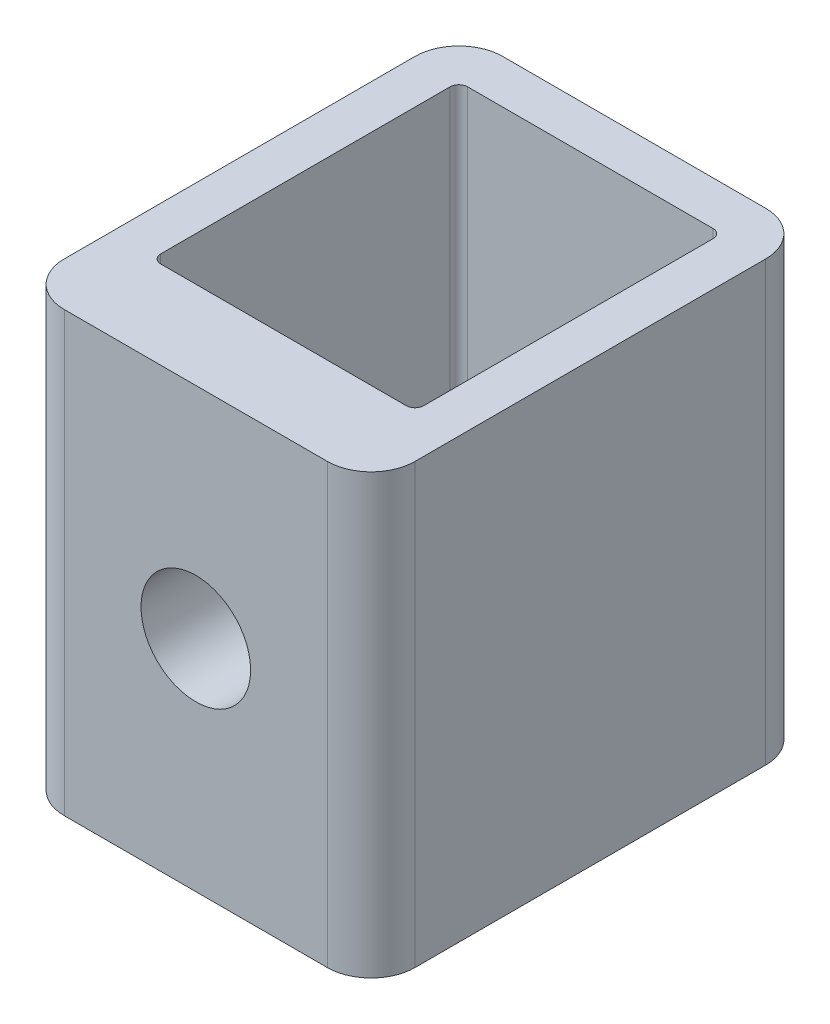
ISO-10303-21;
HEADER;
FILE_DESCRIPTION(('STEP AP214'),'2;1');
FILE_NAME('part.step','',(''),(''),'','','');
FILE_SCHEMA(('AUTOMOTIVE_DESIGN { 1 0 10303 214 1 1 1 1 }'));
ENDSEC;
DATA;
#1=APPLICATION_CONTEXT('core data for automotive mechanical design processes');
#2=APPLICATION_PROTOCOL_DEFINITION('international standard','automotive_design',2000,#1);
#3=PRODUCT_CONTEXT('',#1,'mechanical');
#4=PRODUCT('Part','Part','',(#3));
#5=PRODUCT_RELATED_PRODUCT_CATEGORY('part','',(#4));
#6=PRODUCT_DEFINITION_FORMATION('','',#4);
#7=PRODUCT_DEFINITION_CONTEXT('part definition',#1,'design');
#8=PRODUCT_DEFINITION('design','',#6,#7);
#9=PRODUCT_DEFINITION_SHAPE('','',#8);
#10=(LENGTH_UNIT() NAMED_UNIT(*) SI_UNIT(.MILLI.,.METRE.));
#11=(NAMED_UNIT(*) PLANE_ANGLE_UNIT() SI_UNIT($,.RADIAN.));
#12=(NAMED_UNIT(*) SI_UNIT($,.STERADIAN.) SOLID_ANGLE_UNIT());
#13=UNCERTAINTY_MEASURE_WITH_UNIT(LENGTH_MEASURE(1.E-05),#10,'distance_accuracy_value','');
#14=(GEOMETRIC_REPRESENTATION_CONTEXT(3) GLOBAL_UNCERTAINTY_ASSIGNED_CONTEXT((#13)) GLOBAL_UNIT_ASSIGNED_CONTEXT((#10,
#11,#12)) REPRESENTATION_CONTEXT('',''));
#15=CARTESIAN_POINT('',(0.,0.,0.));
#16=DIRECTION('',(0.,0.,1.));
#17=DIRECTION('',(1.,0.,0.));
#18=AXIS2_PLACEMENT_3D('',#15,#16,#17);
#19=CARTESIAN_POINT('',(3.4,5.,3.9));
#20=DIRECTION('',(0.,1.,0.));
#21=DIRECTION('',(0.,0.,1.));
#22=AXIS2_PLACEMENT_3D('',#19,#20,#21);
#23=CYLINDRICAL_SURFACE('',#22,0.0999999999999998);
#24=DIRECTION('',(0.,1.,0.));
#25=VECTOR('',#24,1.);
#26=CARTESIAN_POINT('',(3.5,5.,3.9));
#27=LINE('',#26,#25);
#28=CARTESIAN_POINT('',(3.5,5.,3.9));
#29=VERTEX_POINT('',#28);
#30=CARTESIAN_POINT('',(3.5,0.,3.9));
#31=VERTEX_POINT('',#30);
#32=EDGE_CURVE('E138',#29,#31,#27,.F.);
#33=ORIENTED_EDGE('',*,*,#32,.T.);
#34=CARTESIAN_POINT('',(3.4,0.,3.9));
#35=DIRECTION('',(0.,1.,0.));
#36=DIRECTION('',(0.,0.,1.));
#37=AXIS2_PLACEMENT_3D('',#34,#35,#36);
#38=CIRCLE('',#37,0.0999999999999998);
#39=CARTESIAN_POINT('',(3.4,0.,4.));
#40=VERTEX_POINT('',#39);
#41=EDGE_CURVE('E19',#40,#31,#38,.T.);
#42=ORIENTED_EDGE('',*,*,#41,.F.);
#43=DIRECTION('',(0.,1.,0.));
#44=VECTOR('',#43,1.);
#45=CARTESIAN_POINT('',(3.4,5.,4.));
#46=LINE('',#45,#44);
#47=CARTESIAN_POINT('',(3.4,5.,4.));
#48=VERTEX_POINT('',#47);
#49=EDGE_CURVE('E213',#40,#48,#46,.T.);
#50=ORIENTED_EDGE('',*,*,#49,.T.);
#51=CARTESIAN_POINT('',(3.4,5.,3.9));
#52=DIRECTION('',(0.,1.,0.));
#53=DIRECTION('',(0.,0.,1.));
#54=AXIS2_PLACEMENT_3D('',#51,#52,#53);
#55=CIRCLE('',#54,0.0999999999999998);
#56=EDGE_CURVE('E136',#29,#48,#55,.F.);
#57=ORIENTED_EDGE('',*,*,#56,.F.);
#58=EDGE_LOOP('',(#33,#42,#50,#57));
#59=FACE_BOUND('',#58,.T.);
#60=ADVANCED_FACE('F16',(#59),#23,.F.);
#61=CARTESIAN_POINT('',(0.6,5.,3.9));
#62=DIRECTION('',(0.,1.,0.));
#63=DIRECTION('',(0.,0.,1.));
#64=AXIS2_PLACEMENT_3D('',#61,#62,#63);
#65=CYLINDRICAL_SURFACE('',#64,0.0999999999999998);
#66=DIRECTION('',(0.,1.,0.));
#67=VECTOR('',#66,1.);
#68=CARTESIAN_POINT('',(0.6,5.,4.));
#69=LINE('',#68,#67);
#70=CARTESIAN_POINT('',(0.6,5.,4.));
#71=VERTEX_POINT('',#70);
#72=CARTESIAN_POINT('',(0.6,0.,4.));
#73=VERTEX_POINT('',#72);
#74=EDGE_CURVE('E215',#71,#73,#69,.F.);
#75=ORIENTED_EDGE('',*,*,#74,.T.);
#76=CARTESIAN_POINT('',(0.6,0.,3.9));
#77=DIRECTION('',(0.,1.,0.));
#78=DIRECTION('',(0.,0.,1.));
#79=AXIS2_PLACEMENT_3D('',#76,#77,#78);
#80=CIRCLE('',#79,0.0999999999999998);
#81=CARTESIAN_POINT('',(0.5,0.,3.9));
#82=VERTEX_POINT('',#81);
#83=EDGE_CURVE('E250',#82,#73,#80,.T.);
#84=ORIENTED_EDGE('',*,*,#83,.F.);
#85=DIRECTION('',(0.,1.,0.));
#86=VECTOR('',#85,1.);
#87=CARTESIAN_POINT('',(0.5,5.,3.9));
#88=LINE('',#87,#86);
#89=CARTESIAN_POINT('',(0.5,5.,3.9));
#90=VERTEX_POINT('',#89);
#91=EDGE_CURVE('E207',#82,#90,#88,.T.);
#92=ORIENTED_EDGE('',*,*,#91,.T.);
#93=CARTESIAN_POINT('',(0.6,5.,3.9));
#94=DIRECTION('',(0.,1.,0.));
#95=DIRECTION('',(0.,0.,1.));
#96=AXIS2_PLACEMENT_3D('',#93,#94,#95);
#97=CIRCLE('',#96,0.0999999999999998);
#98=EDGE_CURVE('E248',#71,#90,#97,.F.);
#99=ORIENTED_EDGE('',*,*,#98,.F.);
#100=EDGE_LOOP('',(#75,#84,#92,#99));
#101=FACE_BOUND('',#100,.T.);
#102=ADVANCED_FACE('F259',(#101),#65,.F.);
#103=CARTESIAN_POINT('',(3.4,5.,0.6));
#104=DIRECTION('',(0.,1.,0.));
#105=DIRECTION('',(0.,0.,1.));
#106=AXIS2_PLACEMENT_3D('',#103,#104,#105);
#107=CYLINDRICAL_SURFACE('',#106,0.1);
#108=DIRECTION('',(0.,1.,0.));
#109=VECTOR('',#108,1.);
#110=CARTESIAN_POINT('',(3.4,5.,0.5));
#111=LINE('',#110,#109);
#112=CARTESIAN_POINT('',(3.4,5.,0.5));
#113=VERTEX_POINT('',#112);
#114=CARTESIAN_POINT('',(3.4,0.,0.5));
#115=VERTEX_POINT('',#114);
#116=EDGE_CURVE('E204',#113,#115,#111,.F.);
#117=ORIENTED_EDGE('',*,*,#116,.T.);
#118=CARTESIAN_POINT('',(3.4,0.,0.6));
#119=DIRECTION('',(0.,1.,0.));
#120=DIRECTION('',(0.,0.,1.));
#121=AXIS2_PLACEMENT_3D('',#118,#119,#120);
#122=CIRCLE('',#121,0.1);
#123=CARTESIAN_POINT('',(3.5,0.,0.6));
#124=VERTEX_POINT('',#123);
#125=EDGE_CURVE('E246',#124,#115,#122,.T.);
#126=ORIENTED_EDGE('',*,*,#125,.F.);
#127=DIRECTION('',(0.,1.,0.));
#128=VECTOR('',#127,1.);
#129=CARTESIAN_POINT('',(3.5,5.,0.6));
#130=LINE('',#129,#128);
#131=CARTESIAN_POINT('',(3.5,5.,0.6));
#132=VERTEX_POINT('',#131);
#133=EDGE_CURVE('E143',#124,#132,#130,.T.);
#134=ORIENTED_EDGE('',*,*,#133,.T.);
#135=CARTESIAN_POINT('',(3.4,5.,0.6));
#136=DIRECTION('',(0.,1.,0.));
#137=DIRECTION('',(0.,0.,1.));
#138=AXIS2_PLACEMENT_3D('',#135,#136,#137);
#139=CIRCLE('',#138,0.1);
#140=EDGE_CURVE('E244',#113,#132,#139,.F.);
#141=ORIENTED_EDGE('',*,*,#140,.F.);
#142=EDGE_LOOP('',(#117,#126,#134,#141));
#143=FACE_BOUND('',#142,.T.);
#144=ADVANCED_FACE('F277',(#143),#107,.F.);
#145=CARTESIAN_POINT('',(0.6,5.,0.6));
#146=DIRECTION('',(0.,1.,0.));
#147=DIRECTION('',(0.,0.,1.));
#148=AXIS2_PLACEMENT_3D('',#145,#146,#147);
#149=CYLINDRICAL_SURFACE('',#148,0.1);
#150=DIRECTION('',(0.,1.,0.));
#151=VECTOR('',#150,1.);
#152=CARTESIAN_POINT('',(0.5,5.,0.6));
#153=LINE('',#152,#151);
#154=CARTESIAN_POINT('',(0.5,5.,0.6));
#155=VERTEX_POINT('',#154);
#156=CARTESIAN_POINT('',(0.5,0.,0.6));
#157=VERTEX_POINT('',#156);
#158=EDGE_CURVE('E210',#155,#157,#153,.F.);
#159=ORIENTED_EDGE('',*,*,#158,.T.);
#160=CARTESIAN_POINT('',(0.6,0.,0.6));
#161=DIRECTION('',(0.,1.,0.));
#162=DIRECTION('',(0.,0.,1.));
#163=AXIS2_PLACEMENT_3D('',#160,#161,#162);
#164=CIRCLE('',#163,0.1);
#165=CARTESIAN_POINT('',(0.6,0.,0.5));
#166=VERTEX_POINT('',#165);
#167=EDGE_CURVE('E242',#166,#157,#164,.T.);
#168=ORIENTED_EDGE('',*,*,#167,.F.);
#169=DIRECTION('',(0.,1.,0.));
#170=VECTOR('',#169,1.);
#171=CARTESIAN_POINT('',(0.6,5.,0.5));
#172=LINE('',#171,#170);
#173=CARTESIAN_POINT('',(0.6,5.,0.5));
#174=VERTEX_POINT('',#173);
#175=EDGE_CURVE('E201',#166,#174,#172,.T.);
#176=ORIENTED_EDGE('',*,*,#175,.T.);
#177=CARTESIAN_POINT('',(0.6,5.,0.6));
#178=DIRECTION('',(0.,1.,0.));
#179=DIRECTION('',(0.,0.,1.));
#180=AXIS2_PLACEMENT_3D('',#177,#178,#179);
#181=CIRCLE('',#180,0.1);
#182=EDGE_CURVE('E240',#155,#174,#181,.F.);
#183=ORIENTED_EDGE('',*,*,#182,.F.);
#184=EDGE_LOOP('',(#159,#168,#176,#183));
#185=FACE_BOUND('',#184,.T.);
#186=ADVANCED_FACE('F269',(#185),#149,.F.);
#187=CARTESIAN_POINT('',(2.,2.5,5.));
#188=DIRECTION('',(0.,0.,1.));
#189=DIRECTION('',(1.,0.,0.));
#190=AXIS2_PLACEMENT_3D('',#187,#188,#189);
#191=CYLINDRICAL_SURFACE('',#190,0.625);
#192=CARTESIAN_POINT('',(2.,2.5,4.));
#193=DIRECTION('',(0.,0.,1.));
#194=DIRECTION('',(1.,0.,0.));
#195=AXIS2_PLACEMENT_3D('',#192,#193,#194);
#196=CIRCLE('',#195,0.625);
#197=CARTESIAN_POINT('',(2.625,2.5,4.));
#198=VERTEX_POINT('',#197);
#199=EDGE_CURVE('E142',#198,#198,#196,.F.);
#200=ORIENTED_EDGE('',*,*,#199,.T.);
#201=EDGE_LOOP('',(#200));
#202=FACE_BOUND('',#201,.T.);
#203=CARTESIAN_POINT('',(2.,2.5,5.));
#204=DIRECTION('',(0.,0.,1.));
#205=DIRECTION('',(1.,0.,0.));
#206=AXIS2_PLACEMENT_3D('',#203,#204,#205);
#207=CIRCLE('',#206,0.625);
#208=CARTESIAN_POINT('',(2.625,2.5,5.));
#209=VERTEX_POINT('',#208);
#210=EDGE_CURVE('E195',#209,#209,#207,.T.);
#211=ORIENTED_EDGE('',*,*,#210,.T.);
#212=EDGE_LOOP('',(#211));
#213=FACE_BOUND('',#212,.T.);
#214=ADVANCED_FACE('F430',(#202,#213),#191,.F.);
#215=CARTESIAN_POINT('',(3.5,0.,0.5));
#216=DIRECTION('',(0.,-1.,0.));
#217=DIRECTION('',(0.,0.,-1.));
#218=AXIS2_PLACEMENT_3D('',#215,#216,#217);
#219=CYLINDRICAL_SURFACE('',#218,0.5);
#220=CARTESIAN_POINT('',(3.5,5.,0.5));
#221=DIRECTION('',(0.,-1.,0.));
#222=DIRECTION('',(0.,0.,-1.));
#223=AXIS2_PLACEMENT_3D('',#220,#221,#222);
#224=CIRCLE('',#223,0.5);
#225=CARTESIAN_POINT('',(3.5,5.,0.));
#226=VERTEX_POINT('',#225);
#227=CARTESIAN_POINT('',(4.,5.,0.5));
#228=VERTEX_POINT('',#227);
#229=EDGE_CURVE('E236',#226,#228,#224,.T.);
#230=ORIENTED_EDGE('',*,*,#229,.T.);
#231=DIRECTION('',(0.,1.,0.));
#232=VECTOR('',#231,1.);
#233=CARTESIAN_POINT('',(4.,0.,0.5));
#234=LINE('',#233,#232);
#235=CARTESIAN_POINT('',(4.,0.,0.5));
#236=VERTEX_POINT('',#235);
#237=EDGE_CURVE('E190',#228,#236,#234,.F.);
#238=ORIENTED_EDGE('',*,*,#237,.T.);
#239=CARTESIAN_POINT('',(3.5,0.,0.5));
#240=DIRECTION('',(0.,-1.,0.));
#241=DIRECTION('',(0.,0.,-1.));
#242=AXIS2_PLACEMENT_3D('',#239,#240,#241);
#243=CIRCLE('',#242,0.5);
#244=CARTESIAN_POINT('',(3.5,0.,0.));
#245=VERTEX_POINT('',#244);
#246=EDGE_CURVE('E238',#236,#245,#243,.F.);
#247=ORIENTED_EDGE('',*,*,#246,.T.);
#248=DIRECTION('',(0.,1.,0.));
#249=VECTOR('',#248,1.);
#250=CARTESIAN_POINT('',(3.5,0.,0.));
#251=LINE('',#250,#249);
#252=EDGE_CURVE('E198',#226,#245,#251,.F.);
#253=ORIENTED_EDGE('',*,*,#252,.F.);
#254=EDGE_LOOP('',(#230,#238,#247,#253));
#255=FACE_BOUND('',#254,.T.);
#256=ADVANCED_FACE('F296',(#255),#219,.T.);
#257=CARTESIAN_POINT('',(3.5,0.,4.5));
#258=DIRECTION('',(0.,1.,0.));
#259=DIRECTION('',(0.,0.,1.));
#260=AXIS2_PLACEMENT_3D('',#257,#258,#259);
#261=CYLINDRICAL_SURFACE('',#260,0.5);
#262=CARTESIAN_POINT('',(3.5,5.,4.5));
#263=DIRECTION('',(0.,1.,0.));
#264=DIRECTION('',(0.,0.,1.));
#265=AXIS2_PLACEMENT_3D('',#262,#263,#264);
#266=CIRCLE('',#265,0.5);
#267=CARTESIAN_POINT('',(4.,5.,4.5));
#268=VERTEX_POINT('',#267);
#269=CARTESIAN_POINT('',(3.5,5.,5.));
#270=VERTEX_POINT('',#269);
#271=EDGE_CURVE('E218',#268,#270,#266,.F.);
#272=ORIENTED_EDGE('',*,*,#271,.T.);
#273=DIRECTION('',(0.,1.,0.));
#274=VECTOR('',#273,1.);
#275=CARTESIAN_POINT('',(3.5,0.,5.));
#276=LINE('',#275,#274);
#277=CARTESIAN_POINT('',(3.5,0.,5.));
#278=VERTEX_POINT('',#277);
#279=EDGE_CURVE('E193',#270,#278,#276,.F.);
#280=ORIENTED_EDGE('',*,*,#279,.T.);
#281=CARTESIAN_POINT('',(3.5,0.,4.5));
#282=DIRECTION('',(0.,1.,0.));
#283=DIRECTION('',(0.,0.,1.));
#284=AXIS2_PLACEMENT_3D('',#281,#282,#283);
#285=CIRCLE('',#284,0.5);
#286=CARTESIAN_POINT('',(4.,0.,4.5));
#287=VERTEX_POINT('',#286);
#288=EDGE_CURVE('E234',#278,#287,#285,.T.);
#289=ORIENTED_EDGE('',*,*,#288,.T.);
#290=DIRECTION('',(0.,1.,0.));
#291=VECTOR('',#290,1.);
#292=CARTESIAN_POINT('',(4.,0.,4.5));
#293=LINE('',#292,#291);
#294=EDGE_CURVE('E187',#287,#268,#293,.T.);
#295=ORIENTED_EDGE('',*,*,#294,.T.);
#296=EDGE_LOOP('',(#272,#280,#289,#295));
#297=FACE_BOUND('',#296,.T.);
#298=ADVANCED_FACE('F303',(#297),#261,.T.);
#299=CARTESIAN_POINT('',(3.5,5.,0.5));
#300=DIRECTION('',(1.,0.,0.));
#301=DIRECTION('',(0.,0.,-1.));
#302=AXIS2_PLACEMENT_3D('',#299,#300,#301);
#303=PLANE('',#302);
#304=ORIENTED_EDGE('',*,*,#32,.F.);
#305=DIRECTION('',(0.,0.,-1.));
#306=VECTOR('',#305,1.);
#307=CARTESIAN_POINT('',(3.5,5.,5.));
#308=LINE('',#307,#306);
#309=EDGE_CURVE('E175',#29,#132,#308,.T.);
#310=ORIENTED_EDGE('',*,*,#309,.T.);
#311=ORIENTED_EDGE('',*,*,#133,.F.);
#312=DIRECTION('',(0.,0.,1.));
#313=VECTOR('',#312,1.);
#314=CARTESIAN_POINT('',(3.5,0.,5.));
#315=LINE('',#314,#313);
#316=EDGE_CURVE('E133',#124,#31,#315,.T.);
#317=ORIENTED_EDGE('',*,*,#316,.T.);
#318=EDGE_LOOP('',(#304,#310,#311,#317));
#319=FACE_BOUND('',#318,.T.);
#320=ADVANCED_FACE('F146',(#319),#303,.F.);
#321=CARTESIAN_POINT('',(3.5,5.,4.));
#322=DIRECTION('',(0.,0.,1.));
#323=DIRECTION('',(1.,0.,0.));
#324=AXIS2_PLACEMENT_3D('',#321,#322,#323);
#325=PLANE('',#324);
#326=ORIENTED_EDGE('',*,*,#49,.F.);
#327=DIRECTION('',(1.,0.,0.));
#328=VECTOR('',#327,1.);
#329=CARTESIAN_POINT('',(0.,0.,4.));
#330=LINE('',#329,#328);
#331=EDGE_CURVE('E135',#40,#73,#330,.F.);
#332=ORIENTED_EDGE('',*,*,#331,.T.);
#333=ORIENTED_EDGE('',*,*,#74,.F.);
#334=DIRECTION('',(1.,0.,0.));
#335=VECTOR('',#334,1.);
#336=CARTESIAN_POINT('',(0.,5.,4.));
#337=LINE('',#336,#335);
#338=EDGE_CURVE('E177',#71,#48,#337,.T.);
#339=ORIENTED_EDGE('',*,*,#338,.T.);
#340=EDGE_LOOP('',(#326,#332,#333,#339));
#341=FACE_BOUND('',#340,.T.);
#342=ORIENTED_EDGE('',*,*,#199,.F.);
#343=EDGE_LOOP('',(#342));
#344=FACE_BOUND('',#343,.T.);
#345=ADVANCED_FACE('F256',(#341,#344),#325,.F.);
#346=CARTESIAN_POINT('',(0.5,5.,0.5));
#347=DIRECTION('',(-1.,0.,0.));
#348=DIRECTION('',(0.,0.,1.));
#349=AXIS2_PLACEMENT_3D('',#346,#347,#348);
#350=PLANE('',#349);
#351=ORIENTED_EDGE('',*,*,#91,.F.);
#352=DIRECTION('',(0.,0.,1.));
#353=VECTOR('',#352,1.);
#354=CARTESIAN_POINT('',(0.5,0.,5.));
#355=LINE('',#354,#353);
#356=EDGE_CURVE('E150',#82,#157,#355,.F.);
#357=ORIENTED_EDGE('',*,*,#356,.T.);
#358=ORIENTED_EDGE('',*,*,#158,.F.);
#359=DIRECTION('',(0.,0.,-1.));
#360=VECTOR('',#359,1.);
#361=CARTESIAN_POINT('',(0.5,5.,5.));
#362=LINE('',#361,#360);
#363=EDGE_CURVE('E180',#155,#90,#362,.F.);
#364=ORIENTED_EDGE('',*,*,#363,.T.);
#365=EDGE_LOOP('',(#351,#357,#358,#364));
#366=FACE_BOUND('',#365,.T.);
#367=ADVANCED_FACE('F265',(#366),#350,.F.);
#368=CARTESIAN_POINT('',(3.5,5.,0.5));
#369=DIRECTION('',(0.,0.,-1.));
#370=DIRECTION('',(-1.,0.,0.));
#371=AXIS2_PLACEMENT_3D('',#368,#369,#370);
#372=PLANE('',#371);
#373=ORIENTED_EDGE('',*,*,#175,.F.);
#374=DIRECTION('',(1.,0.,0.));
#375=VECTOR('',#374,1.);
#376=CARTESIAN_POINT('',(0.,0.,0.5));
#377=LINE('',#376,#375);
#378=EDGE_CURVE('E278',#166,#115,#377,.T.);
#379=ORIENTED_EDGE('',*,*,#378,.T.);
#380=ORIENTED_EDGE('',*,*,#116,.F.);
#381=DIRECTION('',(1.,0.,0.));
#382=VECTOR('',#381,1.);
#383=CARTESIAN_POINT('',(0.,5.,0.5));
#384=LINE('',#383,#382);
#385=EDGE_CURVE('E183',#113,#174,#384,.F.);
#386=ORIENTED_EDGE('',*,*,#385,.T.);
#387=EDGE_LOOP('',(#373,#379,#380,#386));
#388=FACE_BOUND('',#387,.T.);
#389=ADVANCED_FACE('F275',(#388),#372,.F.);
#390=CARTESIAN_POINT('',(0.,0.,0.));
#391=DIRECTION('',(0.,0.,-1.));
#392=DIRECTION('',(-1.,0.,0.));
#393=AXIS2_PLACEMENT_3D('',#390,#391,#392);
#394=PLANE('',#393);
#395=DIRECTION('',(1.,0.,0.));
#396=VECTOR('',#395,1.);
#397=CARTESIAN_POINT('',(0.,0.,0.));
#398=LINE('',#397,#396);
#399=CARTESIAN_POINT('',(0.5,0.,0.));
#400=VERTEX_POINT('',#399);
#401=EDGE_CURVE('E225',#245,#400,#398,.F.);
#402=ORIENTED_EDGE('',*,*,#401,.T.);
#403=DIRECTION('',(0.,1.,0.));
#404=VECTOR('',#403,1.);
#405=CARTESIAN_POINT('',(0.5,0.,0.));
#406=LINE('',#405,#404);
#407=CARTESIAN_POINT('',(0.5,5.,0.));
#408=VERTEX_POINT('',#407);
#409=EDGE_CURVE('E186',#408,#400,#406,.F.);
#410=ORIENTED_EDGE('',*,*,#409,.F.);
#411=DIRECTION('',(1.,0.,0.));
#412=VECTOR('',#411,1.);
#413=CARTESIAN_POINT('',(0.,5.,0.));
#414=LINE('',#413,#412);
#415=EDGE_CURVE('E171',#408,#226,#414,.T.);
#416=ORIENTED_EDGE('',*,*,#415,.T.);
#417=ORIENTED_EDGE('',*,*,#252,.T.);
#418=EDGE_LOOP('',(#402,#410,#416,#417));
#419=FACE_BOUND('',#418,.T.);
#420=ADVANCED_FACE('F316',(#419),#394,.T.);
#421=CARTESIAN_POINT('',(0.,0.,5.));
#422=DIRECTION('',(0.,0.,-1.));
#423=DIRECTION('',(-1.,0.,0.));
#424=AXIS2_PLACEMENT_3D('',#421,#422,#423);
#425=PLANE('',#424);
#426=ORIENTED_EDGE('',*,*,#279,.F.);
#427=DIRECTION('',(1.,0.,0.));
#428=VECTOR('',#427,1.);
#429=CARTESIAN_POINT('',(0.,5.,5.));
#430=LINE('',#429,#428);
#431=CARTESIAN_POINT('',(0.5,5.,5.));
#432=VERTEX_POINT('',#431);
#433=EDGE_CURVE('E166',#270,#432,#430,.F.);
#434=ORIENTED_EDGE('',*,*,#433,.T.);
#435=DIRECTION('',(0.,-1.,0.));
#436=VECTOR('',#435,1.);
#437=CARTESIAN_POINT('',(0.5,0.,5.));
#438=LINE('',#437,#436);
#439=CARTESIAN_POINT('',(0.5,0.,5.));
#440=VERTEX_POINT('',#439);
#441=EDGE_CURVE('E148',#440,#432,#438,.F.);
#442=ORIENTED_EDGE('',*,*,#441,.F.);
#443=DIRECTION('',(1.,0.,0.));
#444=VECTOR('',#443,1.);
#445=CARTESIAN_POINT('',(0.,0.,5.));
#446=LINE('',#445,#444);
#447=EDGE_CURVE('E221',#440,#278,#446,.T.);
#448=ORIENTED_EDGE('',*,*,#447,.T.);
#449=EDGE_LOOP('',(#426,#434,#442,#448));
#450=FACE_BOUND('',#449,.T.);
#451=ORIENTED_EDGE('',*,*,#210,.F.);
#452=EDGE_LOOP('',(#451));
#453=FACE_BOUND('',#452,.T.);
#454=ADVANCED_FACE('F305',(#450,#453),#425,.F.);
#455=CARTESIAN_POINT('',(4.,0.,5.));
#456=DIRECTION('',(-1.,0.,0.));
#457=DIRECTION('',(0.,0.,1.));
#458=AXIS2_PLACEMENT_3D('',#455,#456,#457);
#459=PLANE('',#458);
#460=ORIENTED_EDGE('',*,*,#294,.F.);
#461=DIRECTION('',(0.,0.,1.));
#462=VECTOR('',#461,1.);
#463=CARTESIAN_POINT('',(4.,0.,5.));
#464=LINE('',#463,#462);
#465=EDGE_CURVE('E163',#287,#236,#464,.F.);
#466=ORIENTED_EDGE('',*,*,#465,.T.);
#467=ORIENTED_EDGE('',*,*,#237,.F.);
#468=DIRECTION('',(0.,0.,-1.));
#469=VECTOR('',#468,1.);
#470=CARTESIAN_POINT('',(4.,5.,5.));
#471=LINE('',#470,#469);
#472=EDGE_CURVE('E168',#228,#268,#471,.F.);
#473=ORIENTED_EDGE('',*,*,#472,.T.);
#474=EDGE_LOOP('',(#460,#466,#467,#473));
#475=FACE_BOUND('',#474,.T.);
#476=ADVANCED_FACE('F290',(#475),#459,.F.);
#477=CARTESIAN_POINT('',(0.5,0.,0.5));
#478=DIRECTION('',(0.,1.,0.));
#479=DIRECTION('',(0.,0.,1.));
#480=AXIS2_PLACEMENT_3D('',#477,#478,#479);
#481=CYLINDRICAL_SURFACE('',#480,0.5);
#482=CARTESIAN_POINT('',(0.5,0.,0.5));
#483=DIRECTION('',(0.,1.,0.));
#484=DIRECTION('',(0.,0.,1.));
#485=AXIS2_PLACEMENT_3D('',#482,#483,#484);
#486=CIRCLE('',#485,0.5);
#487=CARTESIAN_POINT('',(0.,0.,0.5));
#488=VERTEX_POINT('',#487);
#489=EDGE_CURVE('E222',#400,#488,#486,.T.);
#490=ORIENTED_EDGE('',*,*,#489,.T.);
#491=DIRECTION('',(0.,1.,0.));
#492=VECTOR('',#491,1.);
#493=CARTESIAN_POINT('',(0.,0.,0.5));
#494=LINE('',#493,#492);
#495=CARTESIAN_POINT('',(0.,5.,0.5));
#496=VERTEX_POINT('',#495);
#497=EDGE_CURVE('E160',#488,#496,#494,.T.);
#498=ORIENTED_EDGE('',*,*,#497,.T.);
#499=CARTESIAN_POINT('',(0.5,5.,0.5));
#500=DIRECTION('',(0.,1.,0.));
#501=DIRECTION('',(0.,0.,1.));
#502=AXIS2_PLACEMENT_3D('',#499,#500,#501);
#503=CIRCLE('',#502,0.5);
#504=EDGE_CURVE('E174',#496,#408,#503,.F.);
#505=ORIENTED_EDGE('',*,*,#504,.T.);
#506=ORIENTED_EDGE('',*,*,#409,.T.);
#507=EDGE_LOOP('',(#490,#498,#505,#506));
#508=FACE_BOUND('',#507,.T.);
#509=ADVANCED_FACE('F314',(#508),#481,.T.);
#510=CARTESIAN_POINT('',(0.,5.,5.));
#511=DIRECTION('',(0.,-1.,0.));
#512=DIRECTION('',(0.,0.,-1.));
#513=AXIS2_PLACEMENT_3D('',#510,#511,#512);
#514=PLANE('',#513);
#515=ORIENTED_EDGE('',*,*,#271,.F.);
#516=ORIENTED_EDGE('',*,*,#472,.F.);
#517=ORIENTED_EDGE('',*,*,#229,.F.);
#518=ORIENTED_EDGE('',*,*,#415,.F.);
#519=ORIENTED_EDGE('',*,*,#504,.F.);
#520=DIRECTION('',(0.,0.,-1.));
#521=VECTOR('',#520,1.);
#522=CARTESIAN_POINT('',(0.,5.,5.));
#523=LINE('',#522,#521);
#524=CARTESIAN_POINT('',(0.,5.,4.5));
#525=VERTEX_POINT('',#524);
#526=EDGE_CURVE('E158',#496,#525,#523,.F.);
#527=ORIENTED_EDGE('',*,*,#526,.T.);
#528=CARTESIAN_POINT('',(0.5,5.,4.5));
#529=DIRECTION('',(0.,-1.,0.));
#530=DIRECTION('',(0.,0.,-1.));
#531=AXIS2_PLACEMENT_3D('',#528,#529,#530);
#532=CIRCLE('',#531,0.5);
#533=EDGE_CURVE('E153',#432,#525,#532,.T.);
#534=ORIENTED_EDGE('',*,*,#533,.F.);
#535=ORIENTED_EDGE('',*,*,#433,.F.);
#536=EDGE_LOOP('',(#515,#516,#517,#518,#519,#527,#534,#535));
#537=FACE_BOUND('',#536,.T.);
#538=ORIENTED_EDGE('',*,*,#56,.T.);
#539=ORIENTED_EDGE('',*,*,#338,.F.);
#540=ORIENTED_EDGE('',*,*,#98,.T.);
#541=ORIENTED_EDGE('',*,*,#363,.F.);
#542=ORIENTED_EDGE('',*,*,#182,.T.);
#543=ORIENTED_EDGE('',*,*,#385,.F.);
#544=ORIENTED_EDGE('',*,*,#140,.T.);
#545=ORIENTED_EDGE('',*,*,#309,.F.);
#546=EDGE_LOOP('',(#538,#539,#540,#541,#542,#543,#544,#545));
#547=FACE_BOUND('',#546,.T.);
#548=ADVANCED_FACE('F253',(#537,#547),#514,.F.);
#549=CARTESIAN_POINT('',(0.5,0.,4.5));
#550=DIRECTION('',(0.,-1.,0.));
#551=DIRECTION('',(0.,0.,-1.));
#552=AXIS2_PLACEMENT_3D('',#549,#550,#551);
#553=CYLINDRICAL_SURFACE('',#552,0.5);
#554=CARTESIAN_POINT('',(0.5,0.,4.5));
#555=DIRECTION('',(0.,-1.,0.));
#556=DIRECTION('',(0.,0.,-1.));
#557=AXIS2_PLACEMENT_3D('',#554,#555,#556);
#558=CIRCLE('',#557,0.5);
#559=CARTESIAN_POINT('',(0.,0.,4.5));
#560=VERTEX_POINT('',#559);
#561=EDGE_CURVE('E33',#560,#440,#558,.F.);
#562=ORIENTED_EDGE('',*,*,#561,.T.);
#563=ORIENTED_EDGE('',*,*,#441,.T.);
#564=ORIENTED_EDGE('',*,*,#533,.T.);
#565=DIRECTION('',(0.,1.,0.));
#566=VECTOR('',#565,1.);
#567=CARTESIAN_POINT('',(0.,0.,4.5));
#568=LINE('',#567,#566);
#569=EDGE_CURVE('E25',#525,#560,#568,.F.);
#570=ORIENTED_EDGE('',*,*,#569,.T.);
#571=EDGE_LOOP('',(#562,#563,#564,#570));
#572=FACE_BOUND('',#571,.T.);
#573=ADVANCED_FACE('F308',(#572),#553,.T.);
#574=CARTESIAN_POINT('',(0.,0.,5.));
#575=DIRECTION('',(0.,1.,0.));
#576=DIRECTION('',(0.,0.,1.));
#577=AXIS2_PLACEMENT_3D('',#574,#575,#576);
#578=PLANE('',#577);
#579=ORIENTED_EDGE('',*,*,#288,.F.);
#580=ORIENTED_EDGE('',*,*,#447,.F.);
#581=ORIENTED_EDGE('',*,*,#561,.F.);
#582=DIRECTION('',(0.,0.,-1.));
#583=VECTOR('',#582,1.);
#584=CARTESIAN_POINT('',(0.,0.,5.));
#585=LINE('',#584,#583);
#586=EDGE_CURVE('E11',#560,#488,#585,.T.);
#587=ORIENTED_EDGE('',*,*,#586,.T.);
#588=ORIENTED_EDGE('',*,*,#489,.F.);
#589=ORIENTED_EDGE('',*,*,#401,.F.);
#590=ORIENTED_EDGE('',*,*,#246,.F.);
#591=ORIENTED_EDGE('',*,*,#465,.F.);
#592=EDGE_LOOP('',(#579,#580,#581,#587,#588,#589,#590,#591));
#593=FACE_BOUND('',#592,.T.);
#594=ORIENTED_EDGE('',*,*,#167,.T.);
#595=ORIENTED_EDGE('',*,*,#356,.F.);
#596=ORIENTED_EDGE('',*,*,#83,.T.);
#597=ORIENTED_EDGE('',*,*,#331,.F.);
#598=ORIENTED_EDGE('',*,*,#41,.T.);
#599=ORIENTED_EDGE('',*,*,#316,.F.);
#600=ORIENTED_EDGE('',*,*,#125,.T.);
#601=ORIENTED_EDGE('',*,*,#378,.F.);
#602=EDGE_LOOP('',(#594,#595,#596,#597,#598,#599,#600,#601));
#603=FACE_BOUND('',#602,.T.);
#604=ADVANCED_FACE('F131',(#593,#603),#578,.F.);
#605=CARTESIAN_POINT('',(0.,0.,5.));
#606=DIRECTION('',(1.,0.,0.));
#607=DIRECTION('',(0.,0.,-1.));
#608=AXIS2_PLACEMENT_3D('',#605,#606,#607);
#609=PLANE('',#608);
#610=ORIENTED_EDGE('',*,*,#569,.F.);
#611=ORIENTED_EDGE('',*,*,#526,.F.);
#612=ORIENTED_EDGE('',*,*,#497,.F.);
#613=ORIENTED_EDGE('',*,*,#586,.F.);
#614=EDGE_LOOP('',(#610,#611,#612,#613));
#615=FACE_BOUND('',#614,.T.);
#616=ADVANCED_FACE('F312',(#615),#609,.F.);
#617=CLOSED_SHELL('',(#60,#102,#144,#186,#214,#256,#298,#320,#345,#367,#389,#420,#454,#476,#509,
#548,#573,#604,#616));
#618=MANIFOLD_SOLID_BREP('B1',#617);
#619=ADVANCED_BREP_SHAPE_REPRESENTATION('',(#18,#618),#14);
#620=SHAPE_DEFINITION_REPRESENTATION(#9,#619);
ENDSEC;
END-ISO-10303-21;
